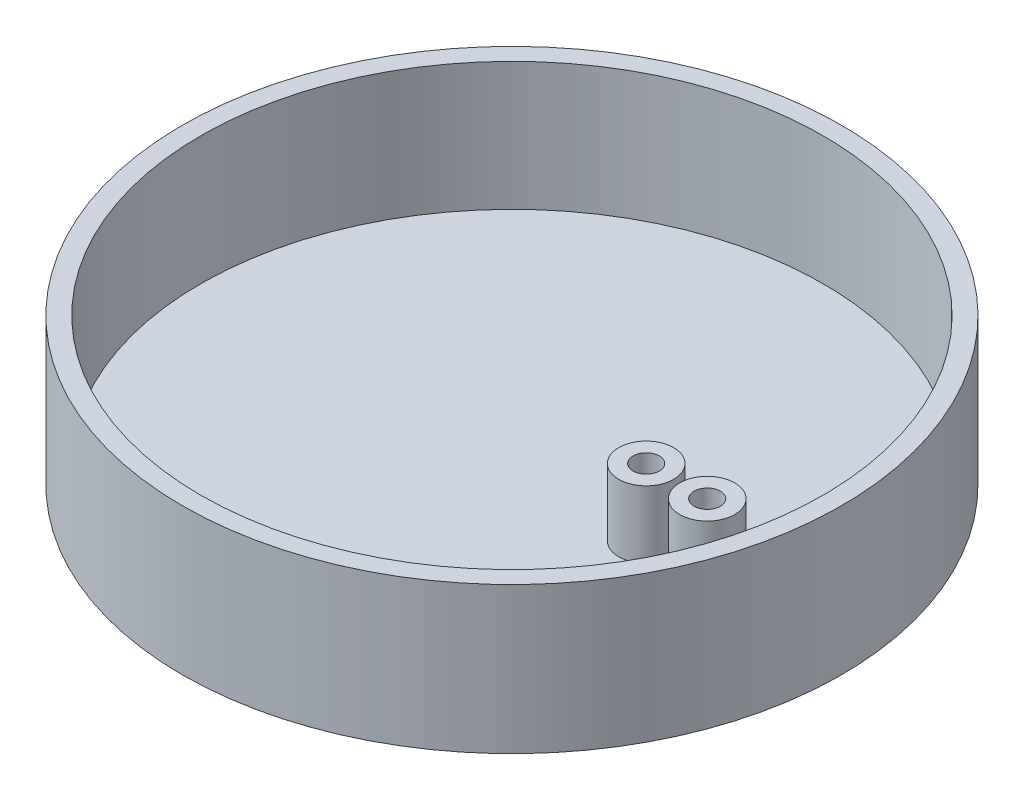
ISO-10303-21;
HEADER;
FILE_DESCRIPTION(('STEP AP214'),'2;1');
FILE_NAME('part.step','',(''),(''),'','','');
FILE_SCHEMA(('AUTOMOTIVE_DESIGN { 1 0 10303 214 1 1 1 1 }'));
ENDSEC;
DATA;
#1=APPLICATION_CONTEXT('core data for automotive mechanical design processes');
#2=APPLICATION_PROTOCOL_DEFINITION('international standard','automotive_design',2000,#1);
#3=PRODUCT_CONTEXT('',#1,'mechanical');
#4=PRODUCT('Part','Part','',(#3));
#5=PRODUCT_RELATED_PRODUCT_CATEGORY('part','',(#4));
#6=PRODUCT_DEFINITION_FORMATION('','',#4);
#7=PRODUCT_DEFINITION_CONTEXT('part definition',#1,'design');
#8=PRODUCT_DEFINITION('design','',#6,#7);
#9=PRODUCT_DEFINITION_SHAPE('','',#8);
#10=(LENGTH_UNIT() NAMED_UNIT(*) SI_UNIT(.MILLI.,.METRE.));
#11=(NAMED_UNIT(*) PLANE_ANGLE_UNIT() SI_UNIT($,.RADIAN.));
#12=(NAMED_UNIT(*) SI_UNIT($,.STERADIAN.) SOLID_ANGLE_UNIT());
#13=UNCERTAINTY_MEASURE_WITH_UNIT(LENGTH_MEASURE(1.E-05),#10,'distance_accuracy_value','');
#14=(GEOMETRIC_REPRESENTATION_CONTEXT(3) GLOBAL_UNCERTAINTY_ASSIGNED_CONTEXT((#13)) GLOBAL_UNIT_ASSIGNED_CONTEXT((#10,
#11,#12)) REPRESENTATION_CONTEXT('',''));
#15=CARTESIAN_POINT('',(0.,0.,0.));
#16=DIRECTION('',(0.,0.,1.));
#17=DIRECTION('',(1.,0.,0.));
#18=AXIS2_PLACEMENT_3D('',#15,#16,#17);
#19=CARTESIAN_POINT('',(0.,3.,0.));
#20=DIRECTION('',(0.,-1.,0.));
#21=DIRECTION('',(0.,0.,-1.));
#22=AXIS2_PLACEMENT_3D('',#19,#20,#21);
#23=CYLINDRICAL_SURFACE('',#22,54.);
#24=CARTESIAN_POINT('',(0.,0.,0.));
#25=DIRECTION('',(0.,1.,0.));
#26=DIRECTION('',(0.,0.,1.));
#27=AXIS2_PLACEMENT_3D('',#24,#25,#26);
#28=CIRCLE('',#27,54.);
#29=CARTESIAN_POINT('',(0.,0.,54.));
#30=VERTEX_POINT('',#29);
#31=EDGE_CURVE('E44',#30,#30,#28,.T.);
#32=ORIENTED_EDGE('',*,*,#31,.T.);
#33=EDGE_LOOP('',(#32));
#34=FACE_BOUND('',#33,.T.);
#35=CARTESIAN_POINT('',(0.,24.,0.));
#36=DIRECTION('',(0.,1.,0.));
#37=DIRECTION('',(0.,0.,1.));
#38=AXIS2_PLACEMENT_3D('',#35,#36,#37);
#39=CIRCLE('',#38,54.);
#40=CARTESIAN_POINT('',(0.,24.,54.));
#41=VERTEX_POINT('',#40);
#42=EDGE_CURVE('E49',#41,#41,#39,.T.);
#43=ORIENTED_EDGE('',*,*,#42,.F.);
#44=EDGE_LOOP('',(#43));
#45=FACE_BOUND('',#44,.T.);
#46=ADVANCED_FACE('F37',(#34,#45),#23,.T.);
#47=CARTESIAN_POINT('',(0.,0.,0.));
#48=DIRECTION('',(0.,1.,0.));
#49=DIRECTION('',(0.,0.,1.));
#50=AXIS2_PLACEMENT_3D('',#47,#48,#49);
#51=PLANE('',#50);
#52=CARTESIAN_POINT('',(22.,0.,0.));
#53=DIRECTION('',(0.,1.,0.));
#54=DIRECTION('',(0.,0.,1.));
#55=AXIS2_PLACEMENT_3D('',#52,#53,#54);
#56=CIRCLE('',#55,2.15);
#57=CARTESIAN_POINT('',(22.,0.,2.15));
#58=VERTEX_POINT('',#57);
#59=EDGE_CURVE('E76',#58,#58,#56,.T.);
#60=ORIENTED_EDGE('',*,*,#59,.T.);
#61=EDGE_LOOP('',(#60));
#62=FACE_BOUND('',#61,.T.);
#63=CARTESIAN_POINT('',(32.,0.,0.));
#64=DIRECTION('',(0.,1.,0.));
#65=DIRECTION('',(0.,0.,1.));
#66=AXIS2_PLACEMENT_3D('',#63,#64,#65);
#67=CIRCLE('',#66,2.15);
#68=CARTESIAN_POINT('',(32.,0.,2.15));
#69=VERTEX_POINT('',#68);
#70=EDGE_CURVE('E73',#69,#69,#67,.T.);
#71=ORIENTED_EDGE('',*,*,#70,.T.);
#72=EDGE_LOOP('',(#71));
#73=FACE_BOUND('',#72,.T.);
#74=ORIENTED_EDGE('',*,*,#31,.F.);
#75=EDGE_LOOP('',(#74));
#76=FACE_BOUND('',#75,.T.);
#77=ADVANCED_FACE('F102',(#62,#73,#76),#51,.F.);
#78=CARTESIAN_POINT('',(0.,24.,0.));
#79=DIRECTION('',(0.,1.,0.));
#80=DIRECTION('',(0.,0.,1.));
#81=AXIS2_PLACEMENT_3D('',#78,#79,#80);
#82=PLANE('',#81);
#83=ORIENTED_EDGE('',*,*,#42,.T.);
#84=EDGE_LOOP('',(#83));
#85=FACE_BOUND('',#84,.T.);
#86=CARTESIAN_POINT('',(0.,24.,0.));
#87=DIRECTION('',(0.,1.,0.));
#88=DIRECTION('',(0.,0.,1.));
#89=AXIS2_PLACEMENT_3D('',#86,#87,#88);
#90=CIRCLE('',#89,51.);
#91=CARTESIAN_POINT('',(0.,24.,51.));
#92=VERTEX_POINT('',#91);
#93=EDGE_CURVE('E55',#92,#92,#90,.T.);
#94=ORIENTED_EDGE('',*,*,#93,.F.);
#95=EDGE_LOOP('',(#94));
#96=FACE_BOUND('',#95,.T.);
#97=ADVANCED_FACE('F107',(#85,#96),#82,.T.);
#98=CARTESIAN_POINT('',(0.,24.,0.));
#99=DIRECTION('',(0.,-1.,0.));
#100=DIRECTION('',(0.,0.,-1.));
#101=AXIS2_PLACEMENT_3D('',#98,#99,#100);
#102=CYLINDRICAL_SURFACE('',#101,51.);
#103=CARTESIAN_POINT('',(0.,3.,0.));
#104=DIRECTION('',(0.,1.,0.));
#105=DIRECTION('',(0.,0.,1.));
#106=AXIS2_PLACEMENT_3D('',#103,#104,#105);
#107=CIRCLE('',#106,51.);
#108=CARTESIAN_POINT('',(0.,3.,51.));
#109=VERTEX_POINT('',#108);
#110=EDGE_CURVE('E10',#109,#109,#107,.F.);
#111=ORIENTED_EDGE('',*,*,#110,.T.);
#112=EDGE_LOOP('',(#111));
#113=FACE_BOUND('',#112,.T.);
#114=ORIENTED_EDGE('',*,*,#93,.T.);
#115=EDGE_LOOP('',(#114));
#116=FACE_BOUND('',#115,.T.);
#117=ADVANCED_FACE('F116',(#113,#116),#102,.F.);
#118=CARTESIAN_POINT('',(0.,3.,0.));
#119=DIRECTION('',(0.,1.,0.));
#120=DIRECTION('',(0.,0.,1.));
#121=AXIS2_PLACEMENT_3D('',#118,#119,#120);
#122=PLANE('',#121);
#123=CARTESIAN_POINT('',(32.,3.,0.));
#124=DIRECTION('',(0.,1.,0.));
#125=DIRECTION('',(0.,0.,1.));
#126=AXIS2_PLACEMENT_3D('',#123,#124,#125);
#127=CIRCLE('',#126,4.5);
#128=CARTESIAN_POINT('',(32.,3.,4.5));
#129=VERTEX_POINT('',#128);
#130=EDGE_CURVE('E40',#129,#129,#127,.F.);
#131=ORIENTED_EDGE('',*,*,#130,.T.);
#132=EDGE_LOOP('',(#131));
#133=FACE_BOUND('',#132,.T.);
#134=CARTESIAN_POINT('',(22.,3.,0.));
#135=DIRECTION('',(0.,1.,0.));
#136=DIRECTION('',(0.,0.,1.));
#137=AXIS2_PLACEMENT_3D('',#134,#135,#136);
#138=CIRCLE('',#137,4.5);
#139=CARTESIAN_POINT('',(22.,3.,4.5));
#140=VERTEX_POINT('',#139);
#141=EDGE_CURVE('E53',#140,#140,#138,.F.);
#142=ORIENTED_EDGE('',*,*,#141,.T.);
#143=EDGE_LOOP('',(#142));
#144=FACE_BOUND('',#143,.T.);
#145=ORIENTED_EDGE('',*,*,#110,.F.);
#146=EDGE_LOOP('',(#145));
#147=FACE_BOUND('',#146,.T.);
#148=ADVANCED_FACE('F97',(#133,#144,#147),#122,.T.);
#149=CARTESIAN_POINT('',(22.,14.,0.));
#150=DIRECTION('',(0.,-1.,0.));
#151=DIRECTION('',(0.,0.,-1.));
#152=AXIS2_PLACEMENT_3D('',#149,#150,#151);
#153=CYLINDRICAL_SURFACE('',#152,4.5);
#154=ORIENTED_EDGE('',*,*,#141,.F.);
#155=EDGE_LOOP('',(#154));
#156=FACE_BOUND('',#155,.T.);
#157=CARTESIAN_POINT('',(22.,14.,0.));
#158=DIRECTION('',(0.,1.,0.));
#159=DIRECTION('',(0.,0.,1.));
#160=AXIS2_PLACEMENT_3D('',#157,#158,#159);
#161=CIRCLE('',#160,4.5);
#162=CARTESIAN_POINT('',(22.,14.,4.5));
#163=VERTEX_POINT('',#162);
#164=EDGE_CURVE('E56',#163,#163,#161,.T.);
#165=ORIENTED_EDGE('',*,*,#164,.F.);
#166=EDGE_LOOP('',(#165));
#167=FACE_BOUND('',#166,.T.);
#168=ADVANCED_FACE('F88',(#156,#167),#153,.T.);
#169=CARTESIAN_POINT('',(22.,14.,0.));
#170=DIRECTION('',(0.,1.,0.));
#171=DIRECTION('',(0.,0.,1.));
#172=AXIS2_PLACEMENT_3D('',#169,#170,#171);
#173=PLANE('',#172);
#174=CARTESIAN_POINT('',(22.,14.,0.));
#175=DIRECTION('',(0.,1.,0.));
#176=DIRECTION('',(0.,0.,1.));
#177=AXIS2_PLACEMENT_3D('',#174,#175,#176);
#178=CIRCLE('',#177,2.15);
#179=CARTESIAN_POINT('',(22.,14.,2.15));
#180=VERTEX_POINT('',#179);
#181=EDGE_CURVE('E69',#180,#180,#178,.T.);
#182=ORIENTED_EDGE('',*,*,#181,.F.);
#183=EDGE_LOOP('',(#182));
#184=FACE_BOUND('',#183,.T.);
#185=ORIENTED_EDGE('',*,*,#164,.T.);
#186=EDGE_LOOP('',(#185));
#187=FACE_BOUND('',#186,.T.);
#188=ADVANCED_FACE('F85',(#184,#187),#173,.T.);
#189=CARTESIAN_POINT('',(32.,14.,0.));
#190=DIRECTION('',(0.,-1.,0.));
#191=DIRECTION('',(0.,0.,-1.));
#192=AXIS2_PLACEMENT_3D('',#189,#190,#191);
#193=CYLINDRICAL_SURFACE('',#192,4.5);
#194=ORIENTED_EDGE('',*,*,#130,.F.);
#195=EDGE_LOOP('',(#194));
#196=FACE_BOUND('',#195,.T.);
#197=CARTESIAN_POINT('',(32.,14.,0.));
#198=DIRECTION('',(0.,1.,0.));
#199=DIRECTION('',(0.,0.,1.));
#200=AXIS2_PLACEMENT_3D('',#197,#198,#199);
#201=CIRCLE('',#200,4.5);
#202=CARTESIAN_POINT('',(32.,14.,4.5));
#203=VERTEX_POINT('',#202);
#204=EDGE_CURVE('E65',#203,#203,#201,.T.);
#205=ORIENTED_EDGE('',*,*,#204,.F.);
#206=EDGE_LOOP('',(#205));
#207=FACE_BOUND('',#206,.T.);
#208=ADVANCED_FACE('F87',(#196,#207),#193,.T.);
#209=CARTESIAN_POINT('',(32.,14.,0.));
#210=DIRECTION('',(0.,1.,0.));
#211=DIRECTION('',(0.,0.,1.));
#212=AXIS2_PLACEMENT_3D('',#209,#210,#211);
#213=PLANE('',#212);
#214=CARTESIAN_POINT('',(32.,14.,0.));
#215=DIRECTION('',(0.,1.,0.));
#216=DIRECTION('',(0.,0.,1.));
#217=AXIS2_PLACEMENT_3D('',#214,#215,#216);
#218=CIRCLE('',#217,2.15);
#219=CARTESIAN_POINT('',(32.,14.,2.15));
#220=VERTEX_POINT('',#219);
#221=EDGE_CURVE('E70',#220,#220,#218,.T.);
#222=ORIENTED_EDGE('',*,*,#221,.F.);
#223=EDGE_LOOP('',(#222));
#224=FACE_BOUND('',#223,.T.);
#225=ORIENTED_EDGE('',*,*,#204,.T.);
#226=EDGE_LOOP('',(#225));
#227=FACE_BOUND('',#226,.T.);
#228=ADVANCED_FACE('F94',(#224,#227),#213,.T.);
#229=CARTESIAN_POINT('',(32.,14.,0.));
#230=DIRECTION('',(0.,-1.,0.));
#231=DIRECTION('',(0.,0.,-1.));
#232=AXIS2_PLACEMENT_3D('',#229,#230,#231);
#233=CYLINDRICAL_SURFACE('',#232,2.15);
#234=ORIENTED_EDGE('',*,*,#221,.T.);
#235=EDGE_LOOP('',(#234));
#236=FACE_BOUND('',#235,.T.);
#237=ORIENTED_EDGE('',*,*,#70,.F.);
#238=EDGE_LOOP('',(#237));
#239=FACE_BOUND('',#238,.T.);
#240=ADVANCED_FACE('F135',(#236,#239),#233,.F.);
#241=CARTESIAN_POINT('',(22.,14.,0.));
#242=DIRECTION('',(0.,-1.,0.));
#243=DIRECTION('',(0.,0.,-1.));
#244=AXIS2_PLACEMENT_3D('',#241,#242,#243);
#245=CYLINDRICAL_SURFACE('',#244,2.15);
#246=ORIENTED_EDGE('',*,*,#181,.T.);
#247=EDGE_LOOP('',(#246));
#248=FACE_BOUND('',#247,.T.);
#249=ORIENTED_EDGE('',*,*,#59,.F.);
#250=EDGE_LOOP('',(#249));
#251=FACE_BOUND('',#250,.T.);
#252=ADVANCED_FACE('F82',(#248,#251),#245,.F.);
#253=CLOSED_SHELL('',(#46,#77,#97,#117,#148,#168,#188,#208,#228,#240,#252));
#254=MANIFOLD_SOLID_BREP('B2',#253);
#255=ADVANCED_BREP_SHAPE_REPRESENTATION('',(#18,#254),#14);
#256=SHAPE_DEFINITION_REPRESENTATION(#9,#255);
ENDSEC;
END-ISO-10303-21;
